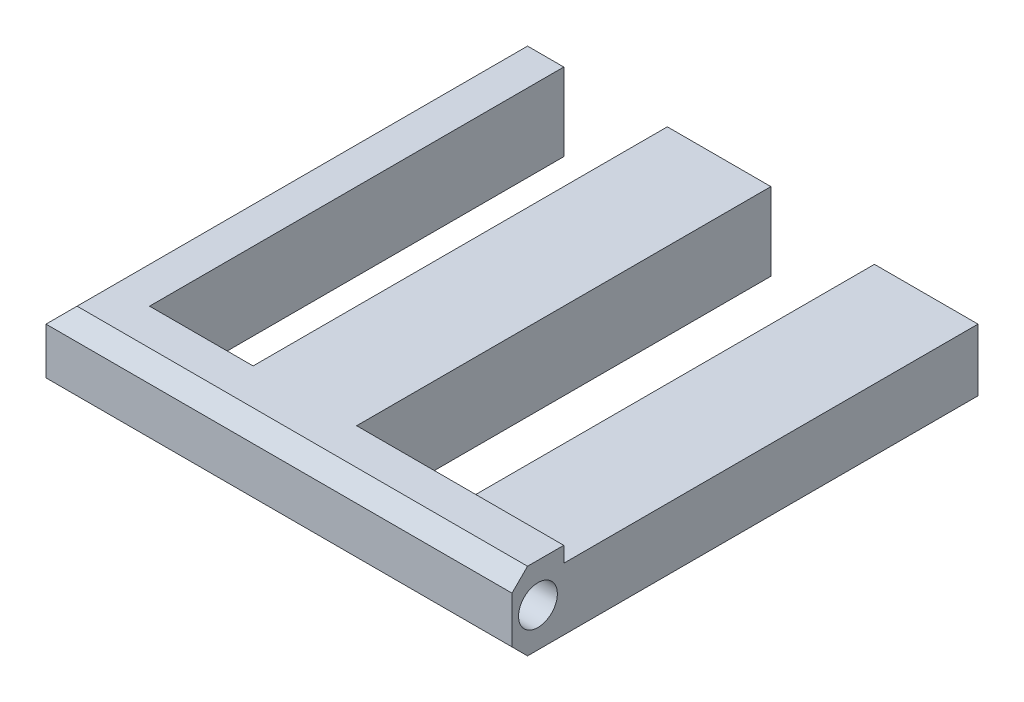
ISO-10303-21;
HEADER;
FILE_DESCRIPTION(('STEP AP214'),'2;1');
FILE_NAME('part.step','',(''),(''),'','','');
FILE_SCHEMA(('AUTOMOTIVE_DESIGN { 1 0 10303 214 1 1 1 1 }'));
ENDSEC;
DATA;
#1=APPLICATION_CONTEXT('core data for automotive mechanical design processes');
#2=APPLICATION_PROTOCOL_DEFINITION('international standard','automotive_design',2000,#1);
#3=PRODUCT_CONTEXT('',#1,'mechanical');
#4=PRODUCT('Part','Part','',(#3));
#5=PRODUCT_RELATED_PRODUCT_CATEGORY('part','',(#4));
#6=PRODUCT_DEFINITION_FORMATION('','',#4);
#7=PRODUCT_DEFINITION_CONTEXT('part definition',#1,'design');
#8=PRODUCT_DEFINITION('design','',#6,#7);
#9=PRODUCT_DEFINITION_SHAPE('','',#8);
#10=(LENGTH_UNIT() NAMED_UNIT(*) SI_UNIT(.MILLI.,.METRE.));
#11=(NAMED_UNIT(*) PLANE_ANGLE_UNIT() SI_UNIT($,.RADIAN.));
#12=(NAMED_UNIT(*) SI_UNIT($,.STERADIAN.) SOLID_ANGLE_UNIT());
#13=UNCERTAINTY_MEASURE_WITH_UNIT(LENGTH_MEASURE(1.E-05),#10,'distance_accuracy_value','');
#14=(GEOMETRIC_REPRESENTATION_CONTEXT(3) GLOBAL_UNCERTAINTY_ASSIGNED_CONTEXT((#13)) GLOBAL_UNIT_ASSIGNED_CONTEXT((#10,
#11,#12)) REPRESENTATION_CONTEXT('',''));
#15=CARTESIAN_POINT('',(0.,0.,0.));
#16=DIRECTION('',(0.,0.,1.));
#17=DIRECTION('',(1.,0.,0.));
#18=AXIS2_PLACEMENT_3D('',#15,#16,#17);
#19=CARTESIAN_POINT('',(0.,38.1,-25.4));
#20=DIRECTION('',(0.,0.,1.));
#21=DIRECTION('',(1.,0.,0.));
#22=AXIS2_PLACEMENT_3D('',#19,#20,#21);
#23=PLANE('',#22);
#24=DIRECTION('',(0.,-1.,0.));
#25=VECTOR('',#24,1.);
#26=CARTESIAN_POINT('',(-101.6,38.1,-25.4));
#27=LINE('',#26,#25);
#28=CARTESIAN_POINT('',(-101.6,38.1,-25.4));
#29=VERTEX_POINT('',#28);
#30=CARTESIAN_POINT('',(-101.6,0.,-25.4));
#31=VERTEX_POINT('',#30);
#32=EDGE_CURVE('E168',#29,#31,#27,.T.);
#33=ORIENTED_EDGE('',*,*,#32,.F.);
#34=DIRECTION('',(-1.,0.,0.));
#35=VECTOR('',#34,1.);
#36=CARTESIAN_POINT('',(0.,38.1,-25.4));
#37=LINE('',#36,#35);
#38=CARTESIAN_POINT('',(0.,38.0999999999999,-25.4));
#39=VERTEX_POINT('',#38);
#40=EDGE_CURVE('E153',#39,#29,#37,.T.);
#41=ORIENTED_EDGE('',*,*,#40,.F.);
#42=DIRECTION('',(0.,1.,0.));
#43=VECTOR('',#42,1.);
#44=CARTESIAN_POINT('',(0.,38.1,-25.4));
#45=LINE('',#44,#43);
#46=CARTESIAN_POINT('',(0.,30.4799999999999,-25.4));
#47=VERTEX_POINT('',#46);
#48=EDGE_CURVE('E164',#47,#39,#45,.T.);
#49=ORIENTED_EDGE('',*,*,#48,.F.);
#50=DIRECTION('',(1.,0.,0.));
#51=VECTOR('',#50,1.);
#52=CARTESIAN_POINT('',(177.8,30.4799999999998,-25.4));
#53=LINE('',#52,#51);
#54=CARTESIAN_POINT('',(-50.7999999999999,30.4799999999999,-25.4));
#55=VERTEX_POINT('',#54);
#56=EDGE_CURVE('E179',#55,#47,#53,.T.);
#57=ORIENTED_EDGE('',*,*,#56,.F.);
#58=DIRECTION('',(0.,-1.,0.));
#59=VECTOR('',#58,1.);
#60=CARTESIAN_POINT('',(-50.8,38.1,-25.4));
#61=LINE('',#60,#59);
#62=CARTESIAN_POINT('',(-50.8,0.,-25.4));
#63=VERTEX_POINT('',#62);
#64=EDGE_CURVE('E158',#55,#63,#61,.T.);
#65=ORIENTED_EDGE('',*,*,#64,.T.);
#66=DIRECTION('',(-1.,0.,0.));
#67=VECTOR('',#66,1.);
#68=CARTESIAN_POINT('',(0.,0.,-25.4));
#69=LINE('',#68,#67);
#70=EDGE_CURVE('E197',#63,#31,#69,.T.);
#71=ORIENTED_EDGE('',*,*,#70,.T.);
#72=EDGE_LOOP('',(#33,#41,#49,#57,#65,#71));
#73=FACE_BOUND('',#72,.T.);
#74=ADVANCED_FACE('F37',(#73),#23,.F.);
#75=CARTESIAN_POINT('',(-101.6,38.1,0.));
#76=DIRECTION('',(-1.,0.,0.));
#77=DIRECTION('',(0.,0.,1.));
#78=AXIS2_PLACEMENT_3D('',#75,#76,#77);
#79=PLANE('',#78);
#80=DIRECTION('',(0.,0.,-1.));
#81=VECTOR('',#80,1.);
#82=CARTESIAN_POINT('',(-101.6,0.,0.));
#83=LINE('',#82,#81);
#84=CARTESIAN_POINT('',(-101.6,0.,-228.6));
#85=VERTEX_POINT('',#84);
#86=EDGE_CURVE('E210',#31,#85,#83,.T.);
#87=ORIENTED_EDGE('',*,*,#86,.T.);
#88=DIRECTION('',(0.,-1.,0.));
#89=VECTOR('',#88,1.);
#90=CARTESIAN_POINT('',(-101.6,38.1,-228.6));
#91=LINE('',#90,#89);
#92=CARTESIAN_POINT('',(-101.6,38.1,-228.6));
#93=VERTEX_POINT('',#92);
#94=EDGE_CURVE('E255',#93,#85,#91,.T.);
#95=ORIENTED_EDGE('',*,*,#94,.F.);
#96=DIRECTION('',(0.,0.,-1.));
#97=VECTOR('',#96,1.);
#98=CARTESIAN_POINT('',(-101.6,38.1,0.));
#99=LINE('',#98,#97);
#100=EDGE_CURVE('E169',#29,#93,#99,.T.);
#101=ORIENTED_EDGE('',*,*,#100,.F.);
#102=ORIENTED_EDGE('',*,*,#32,.T.);
#103=EDGE_LOOP('',(#87,#95,#101,#102));
#104=FACE_BOUND('',#103,.T.);
#105=ADVANCED_FACE('F323',(#104),#79,.F.);
#106=CARTESIAN_POINT('',(0.,38.1,-228.6));
#107=DIRECTION('',(0.,0.,1.));
#108=DIRECTION('',(1.,0.,0.));
#109=AXIS2_PLACEMENT_3D('',#106,#107,#108);
#110=PLANE('',#109);
#111=DIRECTION('',(-1.,0.,0.));
#112=VECTOR('',#111,1.);
#113=CARTESIAN_POINT('',(0.,0.,-228.6));
#114=LINE('',#113,#112);
#115=CARTESIAN_POINT('',(-152.4,0.,-228.6));
#116=VERTEX_POINT('',#115);
#117=EDGE_CURVE('E213',#85,#116,#114,.T.);
#118=ORIENTED_EDGE('',*,*,#117,.T.);
#119=DIRECTION('',(0.,-1.,0.));
#120=VECTOR('',#119,1.);
#121=CARTESIAN_POINT('',(-152.4,38.1,-228.6));
#122=LINE('',#121,#120);
#123=CARTESIAN_POINT('',(-152.4,38.1,-228.6));
#124=VERTEX_POINT('',#123);
#125=EDGE_CURVE('E253',#124,#116,#122,.T.);
#126=ORIENTED_EDGE('',*,*,#125,.F.);
#127=DIRECTION('',(-1.,0.,0.));
#128=VECTOR('',#127,1.);
#129=CARTESIAN_POINT('',(0.,38.1,-228.6));
#130=LINE('',#129,#128);
#131=EDGE_CURVE('E201',#93,#124,#130,.T.);
#132=ORIENTED_EDGE('',*,*,#131,.F.);
#133=ORIENTED_EDGE('',*,*,#94,.T.);
#134=EDGE_LOOP('',(#118,#126,#132,#133));
#135=FACE_BOUND('',#134,.T.);
#136=ADVANCED_FACE('F328',(#135),#110,.F.);
#137=CARTESIAN_POINT('',(-152.4,38.1,0.));
#138=DIRECTION('',(-1.,0.,0.));
#139=DIRECTION('',(0.,0.,1.));
#140=AXIS2_PLACEMENT_3D('',#137,#138,#139);
#141=PLANE('',#140);
#142=DIRECTION('',(0.,0.,-1.));
#143=VECTOR('',#142,1.);
#144=CARTESIAN_POINT('',(-152.4,0.,0.));
#145=LINE('',#144,#143);
#146=CARTESIAN_POINT('',(-152.4,0.,-25.4));
#147=VERTEX_POINT('',#146);
#148=EDGE_CURVE('E216',#147,#116,#145,.T.);
#149=ORIENTED_EDGE('',*,*,#148,.F.);
#150=DIRECTION('',(0.,-1.,0.));
#151=VECTOR('',#150,1.);
#152=CARTESIAN_POINT('',(-152.4,38.1,-25.4));
#153=LINE('',#152,#151);
#154=CARTESIAN_POINT('',(-152.4,38.1,-25.4));
#155=VERTEX_POINT('',#154);
#156=EDGE_CURVE('E251',#155,#147,#153,.T.);
#157=ORIENTED_EDGE('',*,*,#156,.F.);
#158=DIRECTION('',(0.,0.,-1.));
#159=VECTOR('',#158,1.);
#160=CARTESIAN_POINT('',(-152.4,38.1,0.));
#161=LINE('',#160,#159);
#162=EDGE_CURVE('E203',#155,#124,#161,.T.);
#163=ORIENTED_EDGE('',*,*,#162,.T.);
#164=ORIENTED_EDGE('',*,*,#125,.T.);
#165=EDGE_LOOP('',(#149,#157,#163,#164));
#166=FACE_BOUND('',#165,.T.);
#167=ADVANCED_FACE('F331',(#166),#141,.T.);
#168=CARTESIAN_POINT('',(-203.2,0.,-25.4));
#169=VERTEX_POINT('',#168);
#170=EDGE_CURVE('E211',#147,#169,#69,.T.);
#171=ORIENTED_EDGE('',*,*,#170,.T.);
#172=DIRECTION('',(0.,-1.,0.));
#173=VECTOR('',#172,1.);
#174=CARTESIAN_POINT('',(-203.2,38.1,-25.4));
#175=LINE('',#174,#173);
#176=CARTESIAN_POINT('',(-203.2,38.1,-25.4));
#177=VERTEX_POINT('',#176);
#178=EDGE_CURVE('E248',#177,#169,#175,.T.);
#179=ORIENTED_EDGE('',*,*,#178,.F.);
#180=EDGE_CURVE('E172',#155,#177,#37,.T.);
#181=ORIENTED_EDGE('',*,*,#180,.F.);
#182=ORIENTED_EDGE('',*,*,#156,.T.);
#183=EDGE_LOOP('',(#171,#179,#181,#182));
#184=FACE_BOUND('',#183,.T.);
#185=ADVANCED_FACE('F336',(#184),#23,.F.);
#186=CARTESIAN_POINT('',(-203.2,38.1,0.));
#187=DIRECTION('',(-1.,0.,0.));
#188=DIRECTION('',(0.,0.,1.));
#189=AXIS2_PLACEMENT_3D('',#186,#187,#188);
#190=PLANE('',#189);
#191=DIRECTION('',(0.,0.,-1.));
#192=VECTOR('',#191,1.);
#193=CARTESIAN_POINT('',(-203.2,0.,0.));
#194=LINE('',#193,#192);
#195=CARTESIAN_POINT('',(-203.2,0.,-228.6));
#196=VERTEX_POINT('',#195);
#197=EDGE_CURVE('E219',#169,#196,#194,.T.);
#198=ORIENTED_EDGE('',*,*,#197,.T.);
#199=DIRECTION('',(0.,-1.,0.));
#200=VECTOR('',#199,1.);
#201=CARTESIAN_POINT('',(-203.2,38.1,-228.6));
#202=LINE('',#201,#200);
#203=CARTESIAN_POINT('',(-203.2,38.1,-228.6));
#204=VERTEX_POINT('',#203);
#205=EDGE_CURVE('E245',#204,#196,#202,.T.);
#206=ORIENTED_EDGE('',*,*,#205,.F.);
#207=DIRECTION('',(0.,0.,-1.));
#208=VECTOR('',#207,1.);
#209=CARTESIAN_POINT('',(-203.2,38.1,0.));
#210=LINE('',#209,#208);
#211=EDGE_CURVE('E206',#177,#204,#210,.T.);
#212=ORIENTED_EDGE('',*,*,#211,.F.);
#213=ORIENTED_EDGE('',*,*,#178,.T.);
#214=EDGE_LOOP('',(#198,#206,#212,#213));
#215=FACE_BOUND('',#214,.T.);
#216=ADVANCED_FACE('F340',(#215),#190,.F.);
#217=CARTESIAN_POINT('',(0.,38.1,-228.6));
#218=DIRECTION('',(0.,0.,1.));
#219=DIRECTION('',(1.,0.,0.));
#220=AXIS2_PLACEMENT_3D('',#217,#218,#219);
#221=PLANE('',#220);
#222=CARTESIAN_POINT('',(-215.9,19.05,-228.6));
#223=DIRECTION('',(0.,0.,-1.));
#224=DIRECTION('',(-1.,0.,0.));
#225=AXIS2_PLACEMENT_3D('',#222,#223,#224);
#226=CIRCLE('',#225,9.525);
#227=CARTESIAN_POINT('',(-225.425,19.05,-228.6));
#228=VERTEX_POINT('',#227);
#229=EDGE_CURVE('E191',#228,#228,#226,.T.);
#230=ORIENTED_EDGE('',*,*,#229,.F.);
#231=EDGE_LOOP('',(#230));
#232=FACE_BOUND('',#231,.T.);
#233=DIRECTION('',(-1.,0.,0.));
#234=VECTOR('',#233,1.);
#235=CARTESIAN_POINT('',(0.,0.,-228.6));
#236=LINE('',#235,#234);
#237=CARTESIAN_POINT('',(-220.98,0.,-228.6));
#238=VERTEX_POINT('',#237);
#239=EDGE_CURVE('E221',#196,#238,#236,.T.);
#240=ORIENTED_EDGE('',*,*,#239,.T.);
#241=DIRECTION('',(-0.707106781186545,0.70710678118655,0.));
#242=VECTOR('',#241,1.);
#243=CARTESIAN_POINT('',(-220.98,0.,-228.6));
#244=LINE('',#243,#242);
#245=CARTESIAN_POINT('',(-228.6,7.61999999999999,-228.6));
#246=VERTEX_POINT('',#245);
#247=EDGE_CURVE('E275',#238,#246,#244,.T.);
#248=ORIENTED_EDGE('',*,*,#247,.T.);
#249=DIRECTION('',(0.,-1.,0.));
#250=VECTOR('',#249,1.);
#251=CARTESIAN_POINT('',(-228.6,38.1,-228.6));
#252=LINE('',#251,#250);
#253=CARTESIAN_POINT('',(-228.6,30.48,-228.6));
#254=VERTEX_POINT('',#253);
#255=EDGE_CURVE('E242',#254,#246,#252,.T.);
#256=ORIENTED_EDGE('',*,*,#255,.F.);
#257=DIRECTION('',(-0.707106781186548,-0.707106781186548,0.));
#258=VECTOR('',#257,1.);
#259=CARTESIAN_POINT('',(-228.6,30.48,-228.6));
#260=LINE('',#259,#258);
#261=CARTESIAN_POINT('',(-220.98,38.1,-228.6));
#262=VERTEX_POINT('',#261);
#263=EDGE_CURVE('E61',#254,#262,#260,.F.);
#264=ORIENTED_EDGE('',*,*,#263,.T.);
#265=DIRECTION('',(-1.,0.,0.));
#266=VECTOR('',#265,1.);
#267=CARTESIAN_POINT('',(0.,38.1,-228.6));
#268=LINE('',#267,#266);
#269=EDGE_CURVE('E159',#204,#262,#268,.T.);
#270=ORIENTED_EDGE('',*,*,#269,.F.);
#271=ORIENTED_EDGE('',*,*,#205,.T.);
#272=EDGE_LOOP('',(#240,#248,#256,#264,#270,#271));
#273=FACE_BOUND('',#272,.T.);
#274=ADVANCED_FACE('F342',(#232,#273),#221,.F.);
#275=CARTESIAN_POINT('',(-228.6,38.1,0.));
#276=DIRECTION('',(-1.,0.,0.));
#277=DIRECTION('',(0.,0.,1.));
#278=AXIS2_PLACEMENT_3D('',#275,#276,#277);
#279=PLANE('',#278);
#280=ORIENTED_EDGE('',*,*,#255,.T.);
#281=DIRECTION('',(0.,0.,1.));
#282=VECTOR('',#281,1.);
#283=CARTESIAN_POINT('',(-228.6,7.61999999999999,0.));
#284=LINE('',#283,#282);
#285=CARTESIAN_POINT('',(-228.6,7.61999999999999,0.));
#286=VERTEX_POINT('',#285);
#287=EDGE_CURVE('E280',#246,#286,#284,.T.);
#288=ORIENTED_EDGE('',*,*,#287,.T.);
#289=DIRECTION('',(0.,-1.,0.));
#290=VECTOR('',#289,1.);
#291=CARTESIAN_POINT('',(-228.6,38.1,0.));
#292=LINE('',#291,#290);
#293=CARTESIAN_POINT('',(-228.6,30.48,0.));
#294=VERTEX_POINT('',#293);
#295=EDGE_CURVE('E239',#294,#286,#292,.T.);
#296=ORIENTED_EDGE('',*,*,#295,.F.);
#297=DIRECTION('',(0.,0.,-1.));
#298=VECTOR('',#297,1.);
#299=CARTESIAN_POINT('',(-228.6,30.48,0.));
#300=LINE('',#299,#298);
#301=EDGE_CURVE('E277',#294,#254,#300,.T.);
#302=ORIENTED_EDGE('',*,*,#301,.T.);
#303=EDGE_LOOP('',(#280,#288,#296,#302));
#304=FACE_BOUND('',#303,.T.);
#305=ADVANCED_FACE('F344',(#304),#279,.T.);
#306=CARTESIAN_POINT('',(0.,38.1,0.));
#307=DIRECTION('',(0.,0.,1.));
#308=DIRECTION('',(1.,0.,0.));
#309=AXIS2_PLACEMENT_3D('',#306,#307,#308);
#310=PLANE('',#309);
#311=ORIENTED_EDGE('',*,*,#295,.T.);
#312=DIRECTION('',(1.,0.,0.));
#313=VECTOR('',#312,1.);
#314=CARTESIAN_POINT('',(0.,7.61999999999999,0.));
#315=LINE('',#314,#313);
#316=CARTESIAN_POINT('',(0.,7.61999999999999,0.));
#317=VERTEX_POINT('',#316);
#318=EDGE_CURVE('E268',#286,#317,#315,.T.);
#319=ORIENTED_EDGE('',*,*,#318,.T.);
#320=DIRECTION('',(0.,-1.,0.));
#321=VECTOR('',#320,1.);
#322=CARTESIAN_POINT('',(0.,38.1,0.));
#323=LINE('',#322,#321);
#324=CARTESIAN_POINT('',(0.,30.48,0.));
#325=VERTEX_POINT('',#324);
#326=EDGE_CURVE('E237',#325,#317,#323,.T.);
#327=ORIENTED_EDGE('',*,*,#326,.F.);
#328=DIRECTION('',(-1.,0.,0.));
#329=VECTOR('',#328,1.);
#330=CARTESIAN_POINT('',(0.,30.48,0.));
#331=LINE('',#330,#329);
#332=EDGE_CURVE('E266',#325,#294,#331,.T.);
#333=ORIENTED_EDGE('',*,*,#332,.T.);
#334=EDGE_LOOP('',(#311,#319,#327,#333));
#335=FACE_BOUND('',#334,.T.);
#336=ADVANCED_FACE('F297',(#335),#310,.T.);
#337=CARTESIAN_POINT('',(0.,38.1,0.));
#338=DIRECTION('',(-1.,0.,0.));
#339=DIRECTION('',(0.,0.,1.));
#340=AXIS2_PLACEMENT_3D('',#337,#338,#339);
#341=PLANE('',#340);
#342=CARTESIAN_POINT('',(0.,19.05,-12.7289710029541));
#343=DIRECTION('',(1.,0.,0.));
#344=DIRECTION('',(0.,0.,-1.));
#345=AXIS2_PLACEMENT_3D('',#342,#343,#344);
#346=CIRCLE('',#345,9.525);
#347=CARTESIAN_POINT('',(0.,19.05,-22.2539710029541));
#348=VERTEX_POINT('',#347);
#349=EDGE_CURVE('E187',#348,#348,#346,.T.);
#350=ORIENTED_EDGE('',*,*,#349,.F.);
#351=EDGE_LOOP('',(#350));
#352=FACE_BOUND('',#351,.T.);
#353=ORIENTED_EDGE('',*,*,#326,.T.);
#354=DIRECTION('',(0.,-0.707106781186549,-0.707106781186546));
#355=VECTOR('',#354,1.);
#356=CARTESIAN_POINT('',(0.,0.,-7.61999999999996));
#357=LINE('',#356,#355);
#358=CARTESIAN_POINT('',(0.,0.,-7.61999999999996));
#359=VERTEX_POINT('',#358);
#360=EDGE_CURVE('E272',#317,#359,#357,.T.);
#361=ORIENTED_EDGE('',*,*,#360,.T.);
#362=DIRECTION('',(0.,0.,-1.));
#363=VECTOR('',#362,1.);
#364=CARTESIAN_POINT('',(0.,0.,0.));
#365=LINE('',#364,#363);
#366=CARTESIAN_POINT('',(0.,0.,-228.6));
#367=VERTEX_POINT('',#366);
#368=EDGE_CURVE('E224',#359,#367,#365,.T.);
#369=ORIENTED_EDGE('',*,*,#368,.T.);
#370=DIRECTION('',(0.,-1.,0.));
#371=VECTOR('',#370,1.);
#372=CARTESIAN_POINT('',(0.,38.1,-228.6));
#373=LINE('',#372,#371);
#374=CARTESIAN_POINT('',(0.,30.48,-228.6));
#375=VERTEX_POINT('',#374);
#376=EDGE_CURVE('E234',#375,#367,#373,.T.);
#377=ORIENTED_EDGE('',*,*,#376,.F.);
#378=DIRECTION('',(0.,0.,1.));
#379=VECTOR('',#378,1.);
#380=CARTESIAN_POINT('',(0.,30.4799999999999,0.));
#381=LINE('',#380,#379);
#382=EDGE_CURVE('E177',#375,#47,#381,.T.);
#383=ORIENTED_EDGE('',*,*,#382,.T.);
#384=ORIENTED_EDGE('',*,*,#48,.T.);
#385=DIRECTION('',(0.,0.,-1.));
#386=VECTOR('',#385,1.);
#387=CARTESIAN_POINT('',(0.,38.1,0.));
#388=LINE('',#387,#386);
#389=CARTESIAN_POINT('',(0.,38.1,-7.61999999999999));
#390=VERTEX_POINT('',#389);
#391=EDGE_CURVE('E150',#390,#39,#388,.T.);
#392=ORIENTED_EDGE('',*,*,#391,.F.);
#393=DIRECTION('',(0.,0.707106781186546,-0.707106781186549));
#394=VECTOR('',#393,1.);
#395=CARTESIAN_POINT('',(0.,30.48,0.));
#396=LINE('',#395,#394);
#397=EDGE_CURVE('E270',#390,#325,#396,.F.);
#398=ORIENTED_EDGE('',*,*,#397,.T.);
#399=EDGE_LOOP('',(#353,#361,#369,#377,#383,#384,#392,#398));
#400=FACE_BOUND('',#399,.T.);
#401=ADVANCED_FACE('F175',(#352,#400),#341,.F.);
#402=CARTESIAN_POINT('',(0.,38.1,-228.6));
#403=DIRECTION('',(0.,0.,1.));
#404=DIRECTION('',(1.,0.,0.));
#405=AXIS2_PLACEMENT_3D('',#402,#403,#404);
#406=PLANE('',#405);
#407=DIRECTION('',(0.,-1.,0.));
#408=VECTOR('',#407,1.);
#409=CARTESIAN_POINT('',(-50.8,38.1,-228.6));
#410=LINE('',#409,#408);
#411=CARTESIAN_POINT('',(-50.8,30.48,-228.6));
#412=VERTEX_POINT('',#411);
#413=CARTESIAN_POINT('',(-50.8,0.,-228.6));
#414=VERTEX_POINT('',#413);
#415=EDGE_CURVE('E232',#412,#414,#410,.T.);
#416=ORIENTED_EDGE('',*,*,#415,.F.);
#417=DIRECTION('',(1.,0.,0.));
#418=VECTOR('',#417,1.);
#419=CARTESIAN_POINT('',(0.,30.48,-228.6));
#420=LINE('',#419,#418);
#421=EDGE_CURVE('E178',#412,#375,#420,.T.);
#422=ORIENTED_EDGE('',*,*,#421,.T.);
#423=ORIENTED_EDGE('',*,*,#376,.T.);
#424=DIRECTION('',(-1.,0.,0.));
#425=VECTOR('',#424,1.);
#426=CARTESIAN_POINT('',(0.,0.,-228.6));
#427=LINE('',#426,#425);
#428=EDGE_CURVE('E226',#367,#414,#427,.T.);
#429=ORIENTED_EDGE('',*,*,#428,.T.);
#430=EDGE_LOOP('',(#416,#422,#423,#429));
#431=FACE_BOUND('',#430,.T.);
#432=ADVANCED_FACE('F311',(#431),#406,.F.);
#433=CARTESIAN_POINT('',(-50.8,38.1,0.));
#434=DIRECTION('',(-1.,0.,0.));
#435=DIRECTION('',(0.,0.,1.));
#436=AXIS2_PLACEMENT_3D('',#433,#434,#435);
#437=PLANE('',#436);
#438=DIRECTION('',(0.,0.,1.));
#439=VECTOR('',#438,1.);
#440=CARTESIAN_POINT('',(-50.8,30.4799999999999,0.));
#441=LINE('',#440,#439);
#442=EDGE_CURVE('E259',#412,#55,#441,.T.);
#443=ORIENTED_EDGE('',*,*,#442,.F.);
#444=ORIENTED_EDGE('',*,*,#415,.T.);
#445=DIRECTION('',(0.,0.,-1.));
#446=VECTOR('',#445,1.);
#447=CARTESIAN_POINT('',(-50.8,0.,0.));
#448=LINE('',#447,#446);
#449=EDGE_CURVE('E170',#63,#414,#448,.T.);
#450=ORIENTED_EDGE('',*,*,#449,.F.);
#451=ORIENTED_EDGE('',*,*,#64,.F.);
#452=EDGE_LOOP('',(#443,#444,#450,#451));
#453=FACE_BOUND('',#452,.T.);
#454=ADVANCED_FACE('F317',(#453),#437,.T.);
#455=CARTESIAN_POINT('',(0.,38.1,0.));
#456=DIRECTION('',(0.,1.,0.));
#457=DIRECTION('',(0.,0.,1.));
#458=AXIS2_PLACEMENT_3D('',#455,#456,#457);
#459=PLANE('',#458);
#460=ORIENTED_EDGE('',*,*,#269,.T.);
#461=DIRECTION('',(0.,0.,1.));
#462=VECTOR('',#461,1.);
#463=CARTESIAN_POINT('',(-220.98,38.1,0.));
#464=LINE('',#463,#462);
#465=CARTESIAN_POINT('',(-220.98,38.1,-7.61999999999997));
#466=VERTEX_POINT('',#465);
#467=EDGE_CURVE('E11',#262,#466,#464,.T.);
#468=ORIENTED_EDGE('',*,*,#467,.T.);
#469=DIRECTION('',(1.,0.,0.));
#470=VECTOR('',#469,1.);
#471=CARTESIAN_POINT('',(0.,38.1,-7.61999999999999));
#472=LINE('',#471,#470);
#473=EDGE_CURVE('E47',#466,#390,#472,.T.);
#474=ORIENTED_EDGE('',*,*,#473,.T.);
#475=ORIENTED_EDGE('',*,*,#391,.T.);
#476=ORIENTED_EDGE('',*,*,#40,.T.);
#477=ORIENTED_EDGE('',*,*,#100,.T.);
#478=ORIENTED_EDGE('',*,*,#131,.T.);
#479=ORIENTED_EDGE('',*,*,#162,.F.);
#480=ORIENTED_EDGE('',*,*,#180,.T.);
#481=ORIENTED_EDGE('',*,*,#211,.T.);
#482=EDGE_LOOP('',(#460,#468,#474,#475,#476,#477,#478,#479,#480,#481));
#483=FACE_BOUND('',#482,.T.);
#484=ADVANCED_FACE('F152',(#483),#459,.T.);
#485=CARTESIAN_POINT('',(0.,0.,0.));
#486=DIRECTION('',(0.,1.,0.));
#487=DIRECTION('',(0.,0.,1.));
#488=AXIS2_PLACEMENT_3D('',#485,#486,#487);
#489=PLANE('',#488);
#490=ORIENTED_EDGE('',*,*,#368,.F.);
#491=DIRECTION('',(-1.,0.,0.));
#492=VECTOR('',#491,1.);
#493=CARTESIAN_POINT('',(-228.6,0.,-7.61999999999994));
#494=LINE('',#493,#492);
#495=CARTESIAN_POINT('',(-220.98,0.,-7.61999999999994));
#496=VERTEX_POINT('',#495);
#497=EDGE_CURVE('E263',#359,#496,#494,.T.);
#498=ORIENTED_EDGE('',*,*,#497,.T.);
#499=DIRECTION('',(0.,0.,-1.));
#500=VECTOR('',#499,1.);
#501=CARTESIAN_POINT('',(-220.98,0.,-228.6));
#502=LINE('',#501,#500);
#503=EDGE_CURVE('E261',#496,#238,#502,.T.);
#504=ORIENTED_EDGE('',*,*,#503,.T.);
#505=ORIENTED_EDGE('',*,*,#239,.F.);
#506=ORIENTED_EDGE('',*,*,#197,.F.);
#507=ORIENTED_EDGE('',*,*,#170,.F.);
#508=ORIENTED_EDGE('',*,*,#148,.T.);
#509=ORIENTED_EDGE('',*,*,#117,.F.);
#510=ORIENTED_EDGE('',*,*,#86,.F.);
#511=ORIENTED_EDGE('',*,*,#70,.F.);
#512=ORIENTED_EDGE('',*,*,#449,.T.);
#513=ORIENTED_EDGE('',*,*,#428,.F.);
#514=EDGE_LOOP('',(#490,#498,#504,#505,#506,#507,#508,#509,#510,#511,#512,#513));
#515=FACE_BOUND('',#514,.T.);
#516=ADVANCED_FACE('F307',(#515),#489,.F.);
#517=CARTESIAN_POINT('',(-215.9,19.05,-190.5));
#518=DIRECTION('',(0.,0.,-1.));
#519=DIRECTION('',(-1.,0.,0.));
#520=AXIS2_PLACEMENT_3D('',#517,#518,#519);
#521=CYLINDRICAL_SURFACE('',#520,9.525);
#522=CARTESIAN_POINT('',(-215.9,19.05,-190.5));
#523=DIRECTION('',(0.,0.,-1.));
#524=DIRECTION('',(-1.,0.,0.));
#525=AXIS2_PLACEMENT_3D('',#522,#523,#524);
#526=CIRCLE('',#525,9.525);
#527=CARTESIAN_POINT('',(-225.425,19.05,-190.5));
#528=VERTEX_POINT('',#527);
#529=EDGE_CURVE('E194',#528,#528,#526,.T.);
#530=CARTESIAN_POINT('',(-225.425,19.05,-190.5));
#531=CARTESIAN_POINT('',(-225.425,19.05,-190.896875));
#532=CARTESIAN_POINT('',(-225.425,19.05,-191.29375));
#533=CARTESIAN_POINT('',(-225.425,19.05,-192.0875));
#534=CARTESIAN_POINT('',(-225.425,19.05,-192.484375));
#535=CARTESIAN_POINT('',(-225.425,19.05,-193.278125));
#536=CARTESIAN_POINT('',(-225.425,19.05,-193.675));
#537=CARTESIAN_POINT('',(-225.425,19.05,-194.46875));
#538=CARTESIAN_POINT('',(-225.425,19.05,-194.865625));
#539=CARTESIAN_POINT('',(-225.425,19.05,-195.659375));
#540=CARTESIAN_POINT('',(-225.425,19.05,-196.05625));
#541=CARTESIAN_POINT('',(-225.425,19.05,-196.85));
#542=CARTESIAN_POINT('',(-225.425,19.05,-197.246875));
#543=CARTESIAN_POINT('',(-225.425,19.05,-198.040625));
#544=CARTESIAN_POINT('',(-225.425,19.05,-198.4375));
#545=CARTESIAN_POINT('',(-225.425,19.05,-199.23125));
#546=CARTESIAN_POINT('',(-225.425,19.05,-199.628125));
#547=CARTESIAN_POINT('',(-225.425,19.05,-200.421875));
#548=CARTESIAN_POINT('',(-225.425,19.05,-200.81875));
#549=CARTESIAN_POINT('',(-225.425,19.05,-201.6125));
#550=CARTESIAN_POINT('',(-225.425,19.05,-202.009375));
#551=CARTESIAN_POINT('',(-225.425,19.05,-202.803125));
#552=CARTESIAN_POINT('',(-225.425,19.05,-203.2));
#553=CARTESIAN_POINT('',(-225.425,19.05,-203.99375));
#554=CARTESIAN_POINT('',(-225.425,19.05,-204.390625));
#555=CARTESIAN_POINT('',(-225.425,19.05,-205.184375));
#556=CARTESIAN_POINT('',(-225.425,19.05,-205.58125));
#557=CARTESIAN_POINT('',(-225.425,19.05,-206.375));
#558=CARTESIAN_POINT('',(-225.425,19.05,-206.771875));
#559=CARTESIAN_POINT('',(-225.425,19.05,-207.565625));
#560=CARTESIAN_POINT('',(-225.425,19.05,-207.9625));
#561=CARTESIAN_POINT('',(-225.425,19.05,-208.75625));
#562=CARTESIAN_POINT('',(-225.425,19.05,-209.153125));
#563=CARTESIAN_POINT('',(-225.425,19.05,-209.946875));
#564=CARTESIAN_POINT('',(-225.425,19.05,-210.34375));
#565=CARTESIAN_POINT('',(-225.425,19.05,-211.1375));
#566=CARTESIAN_POINT('',(-225.425,19.05,-211.534375));
#567=CARTESIAN_POINT('',(-225.425,19.05,-212.328125));
#568=CARTESIAN_POINT('',(-225.425,19.05,-212.725));
#569=CARTESIAN_POINT('',(-225.425,19.05,-213.51875));
#570=CARTESIAN_POINT('',(-225.425,19.05,-213.915625));
#571=CARTESIAN_POINT('',(-225.425,19.05,-214.709375));
#572=CARTESIAN_POINT('',(-225.425,19.05,-215.10625));
#573=CARTESIAN_POINT('',(-225.425,19.05,-215.9));
#574=CARTESIAN_POINT('',(-225.425,19.05,-216.296875));
#575=CARTESIAN_POINT('',(-225.425,19.05,-217.090625));
#576=CARTESIAN_POINT('',(-225.425,19.05,-217.4875));
#577=CARTESIAN_POINT('',(-225.425,19.05,-218.28125));
#578=CARTESIAN_POINT('',(-225.425,19.05,-218.678125));
#579=CARTESIAN_POINT('',(-225.425,19.05,-219.471875));
#580=CARTESIAN_POINT('',(-225.425,19.05,-219.86875));
#581=CARTESIAN_POINT('',(-225.425,19.05,-220.6625));
#582=CARTESIAN_POINT('',(-225.425,19.05,-221.059375));
#583=CARTESIAN_POINT('',(-225.425,19.05,-221.853125));
#584=CARTESIAN_POINT('',(-225.425,19.05,-222.25));
#585=CARTESIAN_POINT('',(-225.425,19.05,-223.04375));
#586=CARTESIAN_POINT('',(-225.425,19.05,-223.440625));
#587=CARTESIAN_POINT('',(-225.425,19.05,-224.234375));
#588=CARTESIAN_POINT('',(-225.425,19.05,-224.63125));
#589=CARTESIAN_POINT('',(-225.425,19.05,-225.425));
#590=CARTESIAN_POINT('',(-225.425,19.05,-225.821875));
#591=CARTESIAN_POINT('',(-225.425,19.05,-226.615625));
#592=CARTESIAN_POINT('',(-225.425,19.05,-227.0125));
#593=CARTESIAN_POINT('',(-225.425,19.05,-227.80625));
#594=CARTESIAN_POINT('',(-225.425,19.05,-228.203125));
#595=CARTESIAN_POINT('',(-225.425,19.05,-228.6));
#596=B_SPLINE_CURVE_WITH_KNOTS('',3,(#530,#531,#532,#533,#534,#535,#536,#537,#538,#539,#540,
#541,#542,#543,#544,#545,#546,#547,#548,#549,#550,#551,#552,#553,#554,#555,#556,#557,#558,#559,
#560,#561,#562,#563,#564,#565,#566,#567,#568,#569,#570,#571,#572,#573,#574,#575,#576,#577,#578,
#579,#580,#581,#582,#583,#584,#585,#586,#587,#588,#589,#590,#591,#592,#593,#594,#595),
.UNSPECIFIED.,.F.,.F.,(4,2,2,2,2,2,2,2,2,2,2,2,2,2,2,2,2,2,2,2,2,2,2,2,2,2,2,2,2,2,2,2,4),(0.,
1.190625,2.38125,3.571875,4.7625,5.953125,7.14375,8.334375,9.52500000000001,10.715625,11.90625,
13.096875,14.2875,15.478125,16.66875,17.859375,19.05,20.240625,21.43125,22.621875,23.8125,
25.003125,26.19375,27.384375,28.575,29.765625,30.95625,32.146875,33.3375,34.528125,35.71875,
36.909375,38.1),.UNSPECIFIED.);
#597=EDGE_CURVE('BSEAM428',#528,#228,#596,.T.);
#598=ORIENTED_EDGE('',*,*,#529,.F.);
#599=ORIENTED_EDGE('',*,*,#229,.T.);
#600=ORIENTED_EDGE('',*,*,#597,.T.);
#601=ORIENTED_EDGE('',*,*,#597,.F.);
#602=EDGE_LOOP('',(#598,#600,#599,#601));
#603=FACE_BOUND('',#602,.T.);
#604=ADVANCED_FACE('F428',(#603),#521,.F.);
#605=CARTESIAN_POINT('',(-215.9,19.05,-190.5));
#606=DIRECTION('',(0.,0.,-1.));
#607=DIRECTION('',(-1.,0.,0.));
#608=AXIS2_PLACEMENT_3D('',#605,#606,#607);
#609=PLANE('',#608);
#610=ORIENTED_EDGE('',*,*,#529,.T.);
#611=EDGE_LOOP('',(#610));
#612=FACE_BOUND('',#611,.T.);
#613=ADVANCED_FACE('F420',(#612),#609,.T.);
#614=CARTESIAN_POINT('',(-38.1,19.05,-12.7289710029541));
#615=DIRECTION('',(1.,0.,0.));
#616=DIRECTION('',(0.,0.,-1.));
#617=AXIS2_PLACEMENT_3D('',#614,#615,#616);
#618=CYLINDRICAL_SURFACE('',#617,9.525);
#619=CARTESIAN_POINT('',(-38.1,19.05,-12.7289710029541));
#620=DIRECTION('',(1.,0.,0.));
#621=DIRECTION('',(0.,0.,-1.));
#622=AXIS2_PLACEMENT_3D('',#619,#620,#621);
#623=CIRCLE('',#622,9.525);
#624=CARTESIAN_POINT('',(-38.1,19.05,-22.2539710029541));
#625=VERTEX_POINT('',#624);
#626=EDGE_CURVE('E188',#625,#625,#623,.T.);
#627=CARTESIAN_POINT('',(-38.1,19.05,-22.2539710029541));
#628=CARTESIAN_POINT('',(-37.703125,19.05,-22.2539710029541));
#629=CARTESIAN_POINT('',(-37.30625,19.05,-22.2539710029541));
#630=CARTESIAN_POINT('',(-36.5125,19.05,-22.2539710029541));
#631=CARTESIAN_POINT('',(-36.115625,19.05,-22.2539710029541));
#632=CARTESIAN_POINT('',(-35.321875,19.05,-22.2539710029541));
#633=CARTESIAN_POINT('',(-34.925,19.05,-22.2539710029541));
#634=CARTESIAN_POINT('',(-34.13125,19.05,-22.2539710029541));
#635=CARTESIAN_POINT('',(-33.734375,19.05,-22.2539710029541));
#636=CARTESIAN_POINT('',(-32.940625,19.05,-22.2539710029541));
#637=CARTESIAN_POINT('',(-32.54375,19.05,-22.2539710029541));
#638=CARTESIAN_POINT('',(-31.75,19.05,-22.2539710029541));
#639=CARTESIAN_POINT('',(-31.353125,19.05,-22.2539710029541));
#640=CARTESIAN_POINT('',(-30.559375,19.05,-22.2539710029541));
#641=CARTESIAN_POINT('',(-30.1625,19.05,-22.2539710029541));
#642=CARTESIAN_POINT('',(-29.36875,19.05,-22.2539710029541));
#643=CARTESIAN_POINT('',(-28.971875,19.05,-22.2539710029541));
#644=CARTESIAN_POINT('',(-28.178125,19.05,-22.2539710029541));
#645=CARTESIAN_POINT('',(-27.78125,19.05,-22.2539710029541));
#646=CARTESIAN_POINT('',(-26.9875,19.05,-22.2539710029541));
#647=CARTESIAN_POINT('',(-26.590625,19.05,-22.2539710029541));
#648=CARTESIAN_POINT('',(-25.796875,19.05,-22.2539710029541));
#649=CARTESIAN_POINT('',(-25.4,19.05,-22.2539710029541));
#650=CARTESIAN_POINT('',(-24.60625,19.05,-22.2539710029541));
#651=CARTESIAN_POINT('',(-24.209375,19.05,-22.2539710029541));
#652=CARTESIAN_POINT('',(-23.415625,19.05,-22.2539710029541));
#653=CARTESIAN_POINT('',(-23.01875,19.05,-22.2539710029541));
#654=CARTESIAN_POINT('',(-22.225,19.05,-22.2539710029541));
#655=CARTESIAN_POINT('',(-21.828125,19.05,-22.2539710029541));
#656=CARTESIAN_POINT('',(-21.034375,19.05,-22.2539710029541));
#657=CARTESIAN_POINT('',(-20.6375,19.05,-22.2539710029541));
#658=CARTESIAN_POINT('',(-19.84375,19.05,-22.2539710029541));
#659=CARTESIAN_POINT('',(-19.446875,19.05,-22.2539710029541));
#660=CARTESIAN_POINT('',(-18.653125,19.05,-22.2539710029541));
#661=CARTESIAN_POINT('',(-18.25625,19.05,-22.2539710029541));
#662=CARTESIAN_POINT('',(-17.4625,19.05,-22.2539710029541));
#663=CARTESIAN_POINT('',(-17.065625,19.05,-22.2539710029541));
#664=CARTESIAN_POINT('',(-16.271875,19.05,-22.2539710029541));
#665=CARTESIAN_POINT('',(-15.875,19.05,-22.2539710029541));
#666=CARTESIAN_POINT('',(-15.08125,19.05,-22.2539710029541));
#667=CARTESIAN_POINT('',(-14.684375,19.05,-22.2539710029541));
#668=CARTESIAN_POINT('',(-13.890625,19.05,-22.2539710029541));
#669=CARTESIAN_POINT('',(-13.49375,19.05,-22.2539710029541));
#670=CARTESIAN_POINT('',(-12.7,19.05,-22.2539710029541));
#671=CARTESIAN_POINT('',(-12.303125,19.05,-22.2539710029541));
#672=CARTESIAN_POINT('',(-11.509375,19.05,-22.2539710029541));
#673=CARTESIAN_POINT('',(-11.1125,19.05,-22.2539710029541));
#674=CARTESIAN_POINT('',(-10.31875,19.05,-22.2539710029541));
#675=CARTESIAN_POINT('',(-9.92187499999999,19.05,-22.2539710029541));
#676=CARTESIAN_POINT('',(-9.128125,19.05,-22.2539710029541));
#677=CARTESIAN_POINT('',(-8.73124999999999,19.05,-22.2539710029541));
#678=CARTESIAN_POINT('',(-7.93749999999999,19.05,-22.2539710029541));
#679=CARTESIAN_POINT('',(-7.54062499999999,19.05,-22.2539710029541));
#680=CARTESIAN_POINT('',(-6.746875,19.05,-22.2539710029541));
#681=CARTESIAN_POINT('',(-6.35,19.05,-22.2539710029541));
#682=CARTESIAN_POINT('',(-5.55625,19.05,-22.2539710029541));
#683=CARTESIAN_POINT('',(-5.159375,19.05,-22.2539710029541));
#684=CARTESIAN_POINT('',(-4.365625,19.05,-22.2539710029541));
#685=CARTESIAN_POINT('',(-3.96875,19.05,-22.2539710029541));
#686=CARTESIAN_POINT('',(-3.175,19.05,-22.2539710029541));
#687=CARTESIAN_POINT('',(-2.778125,19.05,-22.2539710029541));
#688=CARTESIAN_POINT('',(-1.984375,19.05,-22.2539710029541));
#689=CARTESIAN_POINT('',(-1.5875,19.05,-22.2539710029541));
#690=CARTESIAN_POINT('',(-0.79375,19.05,-22.2539710029541));
#691=CARTESIAN_POINT('',(-0.396875,19.05,-22.2539710029541));
#692=CARTESIAN_POINT('',(0.,19.05,-22.2539710029541));
#693=B_SPLINE_CURVE_WITH_KNOTS('',3,(#627,#628,#629,#630,#631,#632,#633,#634,#635,#636,#637,
#638,#639,#640,#641,#642,#643,#644,#645,#646,#647,#648,#649,#650,#651,#652,#653,#654,#655,#656,
#657,#658,#659,#660,#661,#662,#663,#664,#665,#666,#667,#668,#669,#670,#671,#672,#673,#674,#675,
#676,#677,#678,#679,#680,#681,#682,#683,#684,#685,#686,#687,#688,#689,#690,#691,#692),
.UNSPECIFIED.,.F.,.F.,(4,2,2,2,2,2,2,2,2,2,2,2,2,2,2,2,2,2,2,2,2,2,2,2,2,2,2,2,2,2,2,2,4),(0.,
1.190625,2.38125,3.571875,4.7625,5.953125,7.14375,8.334375,9.52500000000001,10.715625,11.90625,
13.096875,14.2875,15.478125,16.66875,17.859375,19.05,20.240625,21.43125,22.621875,23.8125,
25.003125,26.19375,27.384375,28.575,29.765625,30.95625,32.146875,33.3375,34.528125,35.71875,
36.909375,38.1),.UNSPECIFIED.);
#694=EDGE_CURVE('BSEAM412',#625,#348,#693,.T.);
#695=ORIENTED_EDGE('',*,*,#626,.F.);
#696=ORIENTED_EDGE('',*,*,#349,.T.);
#697=ORIENTED_EDGE('',*,*,#694,.T.);
#698=ORIENTED_EDGE('',*,*,#694,.F.);
#699=EDGE_LOOP('',(#695,#697,#696,#698));
#700=FACE_BOUND('',#699,.T.);
#701=ADVANCED_FACE('F412',(#700),#618,.F.);
#702=CARTESIAN_POINT('',(-38.1,19.05,-12.7289710029541));
#703=DIRECTION('',(1.,0.,0.));
#704=DIRECTION('',(0.,0.,-1.));
#705=AXIS2_PLACEMENT_3D('',#702,#703,#704);
#706=PLANE('',#705);
#707=ORIENTED_EDGE('',*,*,#626,.T.);
#708=EDGE_LOOP('',(#707));
#709=FACE_BOUND('',#708,.T.);
#710=ADVANCED_FACE('F404',(#709),#706,.T.);
#711=CARTESIAN_POINT('',(0.,30.4799999999999,0.));
#712=DIRECTION('',(0.,-1.,0.));
#713=DIRECTION('',(0.,0.,-1.));
#714=AXIS2_PLACEMENT_3D('',#711,#712,#713);
#715=PLANE('',#714);
#716=ORIENTED_EDGE('',*,*,#421,.F.);
#717=ORIENTED_EDGE('',*,*,#442,.T.);
#718=ORIENTED_EDGE('',*,*,#56,.T.);
#719=ORIENTED_EDGE('',*,*,#382,.F.);
#720=EDGE_LOOP('',(#716,#717,#718,#719));
#721=FACE_BOUND('',#720,.T.);
#722=ADVANCED_FACE('F314',(#721),#715,.F.);
#723=CARTESIAN_POINT('',(-220.98,0.,0.));
#724=DIRECTION('',(-0.70710678118655,-0.707106781186545,0.));
#725=DIRECTION('',(0.,0.,1.));
#726=AXIS2_PLACEMENT_3D('',#723,#724,#725);
#727=PLANE('',#726);
#728=ORIENTED_EDGE('',*,*,#247,.F.);
#729=ORIENTED_EDGE('',*,*,#503,.F.);
#730=DIRECTION('',(-0.577350269189624,0.577350269189628,0.577350269189626));
#731=VECTOR('',#730,1.);
#732=CARTESIAN_POINT('',(-223.52,2.53999999999998,-5.07999999999997));
#733=LINE('',#732,#731);
#734=EDGE_CURVE('E183',#286,#496,#733,.F.);
#735=ORIENTED_EDGE('',*,*,#734,.F.);
#736=ORIENTED_EDGE('',*,*,#287,.F.);
#737=EDGE_LOOP('',(#728,#729,#735,#736));
#738=FACE_BOUND('',#737,.T.);
#739=ADVANCED_FACE('F303',(#738),#727,.T.);
#740=CARTESIAN_POINT('',(0.,0.,-7.61999999999996));
#741=DIRECTION('',(0.,-0.707106781186546,0.707106781186549));
#742=DIRECTION('',(1.,0.,0.));
#743=AXIS2_PLACEMENT_3D('',#740,#741,#742);
#744=PLANE('',#743);
#745=ORIENTED_EDGE('',*,*,#360,.F.);
#746=ORIENTED_EDGE('',*,*,#318,.F.);
#747=ORIENTED_EDGE('',*,*,#734,.T.);
#748=ORIENTED_EDGE('',*,*,#497,.F.);
#749=EDGE_LOOP('',(#745,#746,#747,#748));
#750=FACE_BOUND('',#749,.T.);
#751=ADVANCED_FACE('F299',(#750),#744,.T.);
#752=CARTESIAN_POINT('',(0.,30.48,0.));
#753=DIRECTION('',(0.,-0.707106781186549,-0.707106781186546));
#754=DIRECTION('',(-1.,0.,0.));
#755=AXIS2_PLACEMENT_3D('',#752,#753,#754);
#756=PLANE('',#755);
#757=ORIENTED_EDGE('',*,*,#397,.F.);
#758=ORIENTED_EDGE('',*,*,#473,.F.);
#759=DIRECTION('',(-0.577350269189625,-0.577350269189625,0.577350269189627));
#760=VECTOR('',#759,1.);
#761=CARTESIAN_POINT('',(-152.4,106.68,-76.2000000000001));
#762=LINE('',#761,#760);
#763=EDGE_CURVE('E42',#294,#466,#762,.F.);
#764=ORIENTED_EDGE('',*,*,#763,.F.);
#765=ORIENTED_EDGE('',*,*,#332,.F.);
#766=EDGE_LOOP('',(#757,#758,#764,#765));
#767=FACE_BOUND('',#766,.T.);
#768=ADVANCED_FACE('F40',(#767),#756,.F.);
#769=CARTESIAN_POINT('',(-228.6,30.48,0.));
#770=DIRECTION('',(0.707106781186548,-0.707106781186548,0.));
#771=DIRECTION('',(0.,0.,-1.));
#772=AXIS2_PLACEMENT_3D('',#769,#770,#771);
#773=PLANE('',#772);
#774=ORIENTED_EDGE('',*,*,#763,.T.);
#775=ORIENTED_EDGE('',*,*,#467,.F.);
#776=ORIENTED_EDGE('',*,*,#263,.F.);
#777=ORIENTED_EDGE('',*,*,#301,.F.);
#778=EDGE_LOOP('',(#774,#775,#776,#777));
#779=FACE_BOUND('',#778,.T.);
#780=ADVANCED_FACE('F291',(#779),#773,.F.);
#781=CLOSED_SHELL('',(#74,#105,#136,#167,#185,#216,#274,#305,#336,#401,#432,#454,#484,#516,#604,
#613,#701,#710,#722,#739,#751,#768,#780));
#782=MANIFOLD_SOLID_BREP('B2',#781);
#783=ADVANCED_BREP_SHAPE_REPRESENTATION('',(#18,#782),#14);
#784=SHAPE_DEFINITION_REPRESENTATION(#9,#783);
ENDSEC;
END-ISO-10303-21;
